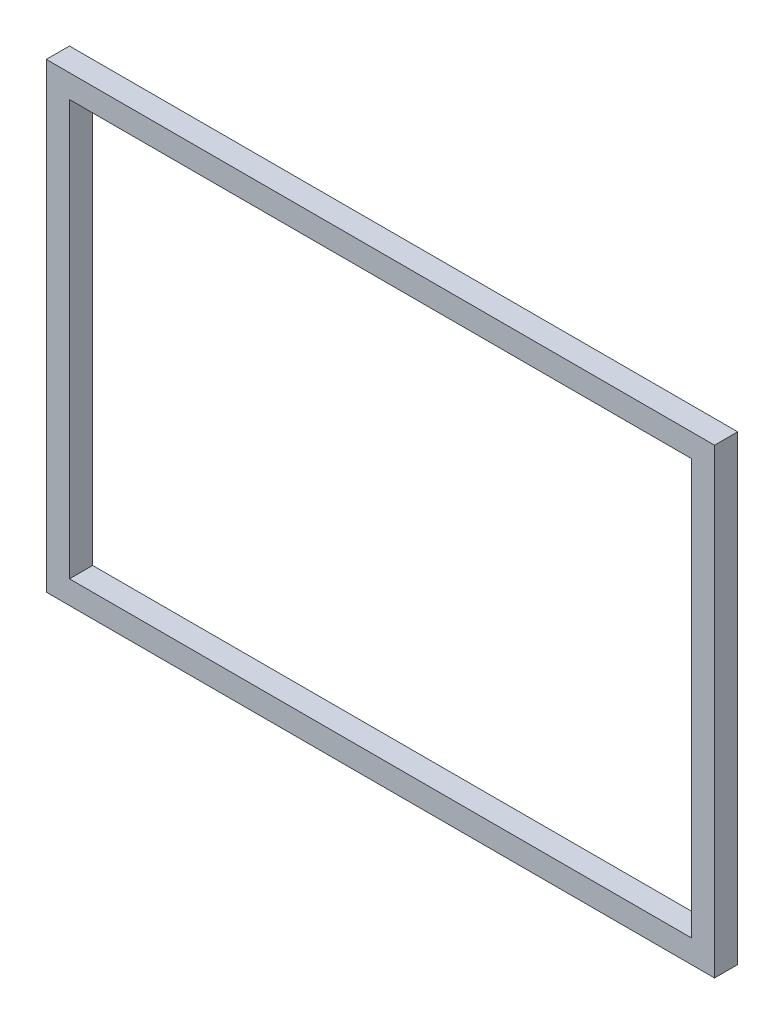
ISO-10303-21;
HEADER;
FILE_DESCRIPTION(('STEP AP214'),'2;1');
FILE_NAME('part.step','',(''),(''),'','','');
FILE_SCHEMA(('AUTOMOTIVE_DESIGN { 1 0 10303 214 1 1 1 1 }'));
ENDSEC;
DATA;
#1=APPLICATION_CONTEXT('core data for automotive mechanical design processes');
#2=APPLICATION_PROTOCOL_DEFINITION('international standard','automotive_design',2000,#1);
#3=PRODUCT_CONTEXT('',#1,'mechanical');
#4=PRODUCT('Part','Part','',(#3));
#5=PRODUCT_RELATED_PRODUCT_CATEGORY('part','',(#4));
#6=PRODUCT_DEFINITION_FORMATION('','',#4);
#7=PRODUCT_DEFINITION_CONTEXT('part definition',#1,'design');
#8=PRODUCT_DEFINITION('design','',#6,#7);
#9=PRODUCT_DEFINITION_SHAPE('','',#8);
#10=(LENGTH_UNIT() NAMED_UNIT(*) SI_UNIT(.MILLI.,.METRE.));
#11=(NAMED_UNIT(*) PLANE_ANGLE_UNIT() SI_UNIT($,.RADIAN.));
#12=(NAMED_UNIT(*) SI_UNIT($,.STERADIAN.) SOLID_ANGLE_UNIT());
#13=UNCERTAINTY_MEASURE_WITH_UNIT(LENGTH_MEASURE(1.E-05),#10,'distance_accuracy_value','');
#14=(GEOMETRIC_REPRESENTATION_CONTEXT(3) GLOBAL_UNCERTAINTY_ASSIGNED_CONTEXT((#13)) GLOBAL_UNIT_ASSIGNED_CONTEXT((#10,
#11,#12)) REPRESENTATION_CONTEXT('',''));
#15=CARTESIAN_POINT('',(0.,0.,0.));
#16=DIRECTION('',(0.,0.,1.));
#17=DIRECTION('',(1.,0.,0.));
#18=AXIS2_PLACEMENT_3D('',#15,#16,#17);
#19=CARTESIAN_POINT('',(45.785,31.615,3.175));
#20=DIRECTION('',(0.,-1.,0.));
#21=DIRECTION('',(0.,0.,-1.));
#22=AXIS2_PLACEMENT_3D('',#19,#20,#21);
#23=PLANE('',#22);
#24=DIRECTION('',(-1.,0.,0.));
#25=VECTOR('',#24,1.);
#26=CARTESIAN_POINT('',(45.785,31.615,0.));
#27=LINE('',#26,#25);
#28=CARTESIAN_POINT('',(45.785,31.615,0.));
#29=VERTEX_POINT('',#28);
#30=CARTESIAN_POINT('',(-45.785,31.615,0.));
#31=VERTEX_POINT('',#30);
#32=EDGE_CURVE('E162',#29,#31,#27,.T.);
#33=ORIENTED_EDGE('',*,*,#32,.T.);
#34=DIRECTION('',(0.,0.,-1.));
#35=VECTOR('',#34,1.);
#36=CARTESIAN_POINT('',(-45.785,31.615,3.175));
#37=LINE('',#36,#35);
#38=CARTESIAN_POINT('',(-45.785,31.615,3.175));
#39=VERTEX_POINT('',#38);
#40=EDGE_CURVE('E12',#39,#31,#37,.T.);
#41=ORIENTED_EDGE('',*,*,#40,.F.);
#42=DIRECTION('',(-1.,0.,0.));
#43=VECTOR('',#42,1.);
#44=CARTESIAN_POINT('',(45.785,31.615,3.175));
#45=LINE('',#44,#43);
#46=CARTESIAN_POINT('',(45.785,31.615,3.175));
#47=VERTEX_POINT('',#46);
#48=EDGE_CURVE('E166',#47,#39,#45,.T.);
#49=ORIENTED_EDGE('',*,*,#48,.F.);
#50=DIRECTION('',(0.,0.,-1.));
#51=VECTOR('',#50,1.);
#52=CARTESIAN_POINT('',(45.785,31.615,3.175));
#53=LINE('',#52,#51);
#54=EDGE_CURVE('E177',#47,#29,#53,.T.);
#55=ORIENTED_EDGE('',*,*,#54,.T.);
#56=EDGE_LOOP('',(#33,#41,#49,#55));
#57=FACE_BOUND('',#56,.T.);
#58=ADVANCED_FACE('F67',(#57),#23,.F.);
#59=CARTESIAN_POINT('',(-45.785,-31.615,3.175));
#60=DIRECTION('',(-1.,0.,0.));
#61=DIRECTION('',(0.,0.,1.));
#62=AXIS2_PLACEMENT_3D('',#59,#60,#61);
#63=PLANE('',#62);
#64=DIRECTION('',(0.,1.,0.));
#65=VECTOR('',#64,1.);
#66=CARTESIAN_POINT('',(-45.785,-31.615,0.));
#67=LINE('',#66,#65);
#68=CARTESIAN_POINT('',(-45.785,-31.615,0.));
#69=VERTEX_POINT('',#68);
#70=EDGE_CURVE('E180',#69,#31,#67,.T.);
#71=ORIENTED_EDGE('',*,*,#70,.F.);
#72=DIRECTION('',(0.,0.,-1.));
#73=VECTOR('',#72,1.);
#74=CARTESIAN_POINT('',(-45.785,-31.615,3.175));
#75=LINE('',#74,#73);
#76=CARTESIAN_POINT('',(-45.785,-31.615,3.175));
#77=VERTEX_POINT('',#76);
#78=EDGE_CURVE('E74',#77,#69,#75,.T.);
#79=ORIENTED_EDGE('',*,*,#78,.F.);
#80=DIRECTION('',(0.,1.,0.));
#81=VECTOR('',#80,1.);
#82=CARTESIAN_POINT('',(-45.785,-31.615,3.175));
#83=LINE('',#82,#81);
#84=EDGE_CURVE('E168',#77,#39,#83,.T.);
#85=ORIENTED_EDGE('',*,*,#84,.T.);
#86=ORIENTED_EDGE('',*,*,#40,.T.);
#87=EDGE_LOOP('',(#71,#79,#85,#86));
#88=FACE_BOUND('',#87,.T.);
#89=ADVANCED_FACE('F197',(#88),#63,.T.);
#90=CARTESIAN_POINT('',(45.785,-31.615,3.175));
#91=DIRECTION('',(0.,-1.,0.));
#92=DIRECTION('',(0.,0.,-1.));
#93=AXIS2_PLACEMENT_3D('',#90,#91,#92);
#94=PLANE('',#93);
#95=DIRECTION('',(-1.,0.,0.));
#96=VECTOR('',#95,1.);
#97=CARTESIAN_POINT('',(45.785,-31.615,0.));
#98=LINE('',#97,#96);
#99=CARTESIAN_POINT('',(45.785,-31.615,0.));
#100=VERTEX_POINT('',#99);
#101=EDGE_CURVE('E183',#100,#69,#98,.T.);
#102=ORIENTED_EDGE('',*,*,#101,.F.);
#103=DIRECTION('',(0.,0.,-1.));
#104=VECTOR('',#103,1.);
#105=CARTESIAN_POINT('',(45.785,-31.615,3.175));
#106=LINE('',#105,#104);
#107=CARTESIAN_POINT('',(45.785,-31.615,3.175));
#108=VERTEX_POINT('',#107);
#109=EDGE_CURVE('E189',#108,#100,#106,.T.);
#110=ORIENTED_EDGE('',*,*,#109,.F.);
#111=DIRECTION('',(-1.,0.,0.));
#112=VECTOR('',#111,1.);
#113=CARTESIAN_POINT('',(45.785,-31.615,3.175));
#114=LINE('',#113,#112);
#115=EDGE_CURVE('E172',#108,#77,#114,.T.);
#116=ORIENTED_EDGE('',*,*,#115,.T.);
#117=ORIENTED_EDGE('',*,*,#78,.T.);
#118=EDGE_LOOP('',(#102,#110,#116,#117));
#119=FACE_BOUND('',#118,.T.);
#120=ADVANCED_FACE('F193',(#119),#94,.T.);
#121=CARTESIAN_POINT('',(45.785,-31.615,3.175));
#122=DIRECTION('',(-1.,0.,0.));
#123=DIRECTION('',(0.,0.,1.));
#124=AXIS2_PLACEMENT_3D('',#121,#122,#123);
#125=PLANE('',#124);
#126=DIRECTION('',(0.,1.,0.));
#127=VECTOR('',#126,1.);
#128=CARTESIAN_POINT('',(45.785,-31.615,0.));
#129=LINE('',#128,#127);
#130=EDGE_CURVE('E169',#100,#29,#129,.T.);
#131=ORIENTED_EDGE('',*,*,#130,.T.);
#132=ORIENTED_EDGE('',*,*,#54,.F.);
#133=DIRECTION('',(0.,1.,0.));
#134=VECTOR('',#133,1.);
#135=CARTESIAN_POINT('',(45.785,-31.615,3.175));
#136=LINE('',#135,#134);
#137=EDGE_CURVE('E175',#108,#47,#136,.T.);
#138=ORIENTED_EDGE('',*,*,#137,.F.);
#139=ORIENTED_EDGE('',*,*,#109,.T.);
#140=EDGE_LOOP('',(#131,#132,#138,#139));
#141=FACE_BOUND('',#140,.T.);
#142=ADVANCED_FACE('F205',(#141),#125,.F.);
#143=CARTESIAN_POINT('',(0.,0.,3.175));
#144=DIRECTION('',(0.,0.,-1.));
#145=DIRECTION('',(-1.,0.,0.));
#146=AXIS2_PLACEMENT_3D('',#143,#144,#145);
#147=PLANE('',#146);
#148=DIRECTION('',(0.,1.,0.));
#149=VECTOR('',#148,1.);
#150=CARTESIAN_POINT('',(-42.61,-28.44,3.175));
#151=LINE('',#150,#149);
#152=CARTESIAN_POINT('',(-42.61,-28.44,3.175));
#153=VERTEX_POINT('',#152);
#154=CARTESIAN_POINT('',(-42.61,28.44,3.175));
#155=VERTEX_POINT('',#154);
#156=EDGE_CURVE('E142',#153,#155,#151,.T.);
#157=ORIENTED_EDGE('',*,*,#156,.T.);
#158=DIRECTION('',(1.,0.,0.));
#159=VECTOR('',#158,1.);
#160=CARTESIAN_POINT('',(-42.61,28.44,3.175));
#161=LINE('',#160,#159);
#162=CARTESIAN_POINT('',(42.61,28.44,3.175));
#163=VERTEX_POINT('',#162);
#164=EDGE_CURVE('E137',#155,#163,#161,.T.);
#165=ORIENTED_EDGE('',*,*,#164,.T.);
#166=DIRECTION('',(0.,1.,0.));
#167=VECTOR('',#166,1.);
#168=CARTESIAN_POINT('',(42.61,-28.44,3.175));
#169=LINE('',#168,#167);
#170=CARTESIAN_POINT('',(42.61,-28.44,3.175));
#171=VERTEX_POINT('',#170);
#172=EDGE_CURVE('E129',#171,#163,#169,.T.);
#173=ORIENTED_EDGE('',*,*,#172,.F.);
#174=DIRECTION('',(1.,0.,0.));
#175=VECTOR('',#174,1.);
#176=CARTESIAN_POINT('',(-42.61,-28.44,3.175));
#177=LINE('',#176,#175);
#178=EDGE_CURVE('E136',#153,#171,#177,.T.);
#179=ORIENTED_EDGE('',*,*,#178,.F.);
#180=EDGE_LOOP('',(#157,#165,#173,#179));
#181=FACE_BOUND('',#180,.T.);
#182=ORIENTED_EDGE('',*,*,#48,.T.);
#183=ORIENTED_EDGE('',*,*,#84,.F.);
#184=ORIENTED_EDGE('',*,*,#115,.F.);
#185=ORIENTED_EDGE('',*,*,#137,.T.);
#186=EDGE_LOOP('',(#182,#183,#184,#185));
#187=FACE_BOUND('',#186,.T.);
#188=ADVANCED_FACE('F144',(#181,#187),#147,.F.);
#189=CARTESIAN_POINT('',(0.,0.,0.));
#190=DIRECTION('',(0.,0.,-1.));
#191=DIRECTION('',(-1.,0.,0.));
#192=AXIS2_PLACEMENT_3D('',#189,#190,#191);
#193=PLANE('',#192);
#194=DIRECTION('',(1.,0.,0.));
#195=VECTOR('',#194,1.);
#196=CARTESIAN_POINT('',(-42.61,28.44,0.));
#197=LINE('',#196,#195);
#198=CARTESIAN_POINT('',(-42.61,28.44,0.));
#199=VERTEX_POINT('',#198);
#200=CARTESIAN_POINT('',(42.61,28.44,0.));
#201=VERTEX_POINT('',#200);
#202=EDGE_CURVE('E89',#199,#201,#197,.T.);
#203=ORIENTED_EDGE('',*,*,#202,.F.);
#204=DIRECTION('',(0.,1.,0.));
#205=VECTOR('',#204,1.);
#206=CARTESIAN_POINT('',(-42.61,-28.44,0.));
#207=LINE('',#206,#205);
#208=CARTESIAN_POINT('',(-42.61,-28.44,0.));
#209=VERTEX_POINT('',#208);
#210=EDGE_CURVE('E147',#209,#199,#207,.T.);
#211=ORIENTED_EDGE('',*,*,#210,.F.);
#212=DIRECTION('',(1.,0.,0.));
#213=VECTOR('',#212,1.);
#214=CARTESIAN_POINT('',(-42.61,-28.44,0.));
#215=LINE('',#214,#213);
#216=CARTESIAN_POINT('',(42.61,-28.44,0.));
#217=VERTEX_POINT('',#216);
#218=EDGE_CURVE('E150',#209,#217,#215,.T.);
#219=ORIENTED_EDGE('',*,*,#218,.T.);
#220=DIRECTION('',(0.,1.,0.));
#221=VECTOR('',#220,1.);
#222=CARTESIAN_POINT('',(42.61,-28.44,0.));
#223=LINE('',#222,#221);
#224=EDGE_CURVE('E156',#217,#201,#223,.T.);
#225=ORIENTED_EDGE('',*,*,#224,.T.);
#226=EDGE_LOOP('',(#203,#211,#219,#225));
#227=FACE_BOUND('',#226,.T.);
#228=ORIENTED_EDGE('',*,*,#32,.F.);
#229=ORIENTED_EDGE('',*,*,#130,.F.);
#230=ORIENTED_EDGE('',*,*,#101,.T.);
#231=ORIENTED_EDGE('',*,*,#70,.T.);
#232=EDGE_LOOP('',(#228,#229,#230,#231));
#233=FACE_BOUND('',#232,.T.);
#234=ADVANCED_FACE('F202',(#227,#233),#193,.T.);
#235=CARTESIAN_POINT('',(-42.61,28.44,3.175));
#236=DIRECTION('',(0.,1.,0.));
#237=DIRECTION('',(0.,0.,1.));
#238=AXIS2_PLACEMENT_3D('',#235,#236,#237);
#239=PLANE('',#238);
#240=ORIENTED_EDGE('',*,*,#202,.T.);
#241=DIRECTION('',(0.,0.,-1.));
#242=VECTOR('',#241,1.);
#243=CARTESIAN_POINT('',(42.61,28.44,3.175));
#244=LINE('',#243,#242);
#245=EDGE_CURVE('E131',#163,#201,#244,.T.);
#246=ORIENTED_EDGE('',*,*,#245,.F.);
#247=ORIENTED_EDGE('',*,*,#164,.F.);
#248=DIRECTION('',(0.,0.,-1.));
#249=VECTOR('',#248,1.);
#250=CARTESIAN_POINT('',(-42.61,28.44,3.175));
#251=LINE('',#250,#249);
#252=EDGE_CURVE('E160',#155,#199,#251,.T.);
#253=ORIENTED_EDGE('',*,*,#252,.T.);
#254=EDGE_LOOP('',(#240,#246,#247,#253));
#255=FACE_BOUND('',#254,.T.);
#256=ADVANCED_FACE('F140',(#255),#239,.F.);
#257=CARTESIAN_POINT('',(-42.61,-28.44,3.175));
#258=DIRECTION('',(-1.,0.,0.));
#259=DIRECTION('',(0.,0.,1.));
#260=AXIS2_PLACEMENT_3D('',#257,#258,#259);
#261=PLANE('',#260);
#262=ORIENTED_EDGE('',*,*,#210,.T.);
#263=ORIENTED_EDGE('',*,*,#252,.F.);
#264=ORIENTED_EDGE('',*,*,#156,.F.);
#265=DIRECTION('',(0.,0.,-1.));
#266=VECTOR('',#265,1.);
#267=CARTESIAN_POINT('',(-42.61,-28.44,3.175));
#268=LINE('',#267,#266);
#269=EDGE_CURVE('E163',#153,#209,#268,.T.);
#270=ORIENTED_EDGE('',*,*,#269,.T.);
#271=EDGE_LOOP('',(#262,#263,#264,#270));
#272=FACE_BOUND('',#271,.T.);
#273=ADVANCED_FACE('F254',(#272),#261,.F.);
#274=CARTESIAN_POINT('',(-42.61,-28.44,3.175));
#275=DIRECTION('',(0.,1.,0.));
#276=DIRECTION('',(0.,0.,1.));
#277=AXIS2_PLACEMENT_3D('',#274,#275,#276);
#278=PLANE('',#277);
#279=ORIENTED_EDGE('',*,*,#218,.F.);
#280=ORIENTED_EDGE('',*,*,#269,.F.);
#281=ORIENTED_EDGE('',*,*,#178,.T.);
#282=DIRECTION('',(0.,0.,-1.));
#283=VECTOR('',#282,1.);
#284=CARTESIAN_POINT('',(42.61,-28.44,3.175));
#285=LINE('',#284,#283);
#286=EDGE_CURVE('E81',#171,#217,#285,.T.);
#287=ORIENTED_EDGE('',*,*,#286,.T.);
#288=EDGE_LOOP('',(#279,#280,#281,#287));
#289=FACE_BOUND('',#288,.T.);
#290=ADVANCED_FACE('F262',(#289),#278,.T.);
#291=CARTESIAN_POINT('',(42.61,-28.44,3.175));
#292=DIRECTION('',(-1.,0.,0.));
#293=DIRECTION('',(0.,0.,1.));
#294=AXIS2_PLACEMENT_3D('',#291,#292,#293);
#295=PLANE('',#294);
#296=ORIENTED_EDGE('',*,*,#224,.F.);
#297=ORIENTED_EDGE('',*,*,#286,.F.);
#298=ORIENTED_EDGE('',*,*,#172,.T.);
#299=ORIENTED_EDGE('',*,*,#245,.T.);
#300=EDGE_LOOP('',(#296,#297,#298,#299));
#301=FACE_BOUND('',#300,.T.);
#302=ADVANCED_FACE('F130',(#301),#295,.T.);
#303=CLOSED_SHELL('',(#58,#89,#120,#142,#188,#234,#256,#273,#290,#302));
#304=MANIFOLD_SOLID_BREP('B2',#303);
#305=ADVANCED_BREP_SHAPE_REPRESENTATION('',(#18,#304),#14);
#306=SHAPE_DEFINITION_REPRESENTATION(#9,#305);
ENDSEC;
END-ISO-10303-21;
